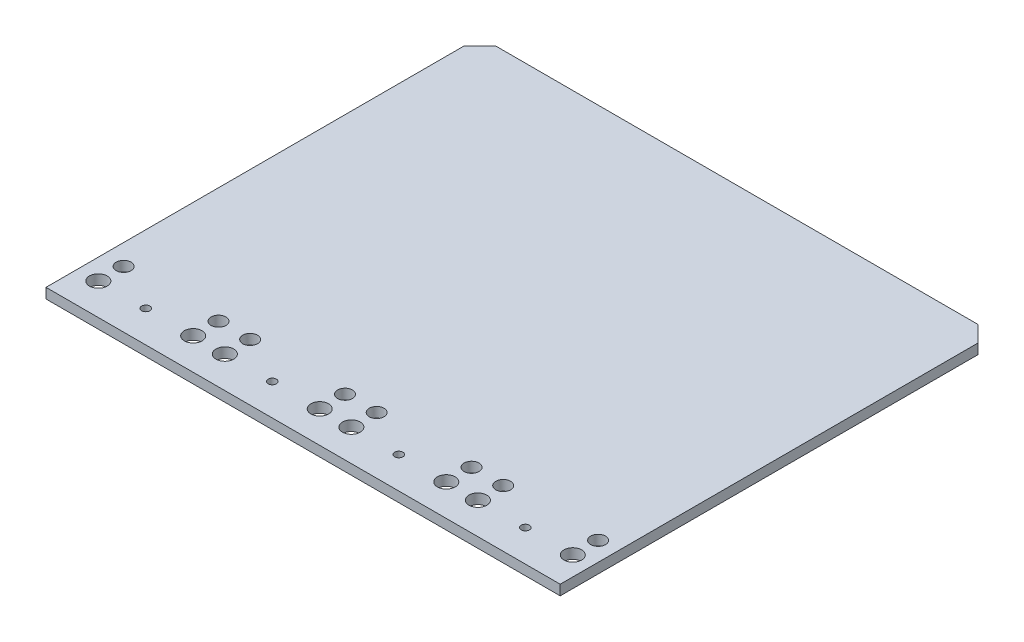
ISO-10303-21;
HEADER;
FILE_DESCRIPTION(('STEP AP214'),'2;1');
FILE_NAME('part.step','',(''),(''),'','','');
FILE_SCHEMA(('AUTOMOTIVE_DESIGN { 1 0 10303 214 1 1 1 1 }'));
ENDSEC;
DATA;
#1=APPLICATION_CONTEXT('core data for automotive mechanical design processes');
#2=APPLICATION_PROTOCOL_DEFINITION('international standard','automotive_design',2000,#1);
#3=PRODUCT_CONTEXT('',#1,'mechanical');
#4=PRODUCT('Part','Part','',(#3));
#5=PRODUCT_RELATED_PRODUCT_CATEGORY('part','',(#4));
#6=PRODUCT_DEFINITION_FORMATION('','',#4);
#7=PRODUCT_DEFINITION_CONTEXT('part definition',#1,'design');
#8=PRODUCT_DEFINITION('design','',#6,#7);
#9=PRODUCT_DEFINITION_SHAPE('','',#8);
#10=(LENGTH_UNIT() NAMED_UNIT(*) SI_UNIT(.MILLI.,.METRE.));
#11=(NAMED_UNIT(*) PLANE_ANGLE_UNIT() SI_UNIT($,.RADIAN.));
#12=(NAMED_UNIT(*) SI_UNIT($,.STERADIAN.) SOLID_ANGLE_UNIT());
#13=UNCERTAINTY_MEASURE_WITH_UNIT(LENGTH_MEASURE(1.E-05),#10,'distance_accuracy_value','');
#14=(GEOMETRIC_REPRESENTATION_CONTEXT(3) GLOBAL_UNCERTAINTY_ASSIGNED_CONTEXT((#13)) GLOBAL_UNIT_ASSIGNED_CONTEXT((#10,
#11,#12)) REPRESENTATION_CONTEXT('',''));
#15=CARTESIAN_POINT('',(0.,0.,0.));
#16=DIRECTION('',(0.,0.,1.));
#17=DIRECTION('',(1.,0.,0.));
#18=AXIS2_PLACEMENT_3D('',#15,#16,#17);
#19=CARTESIAN_POINT('',(40.64,1.6,-34.29));
#20=DIRECTION('',(-1.,0.,0.));
#21=DIRECTION('',(0.,0.,1.));
#22=AXIS2_PLACEMENT_3D('',#19,#20,#21);
#23=PLANE('',#22);
#24=DIRECTION('',(0.,0.,-1.));
#25=VECTOR('',#24,1.);
#26=CARTESIAN_POINT('',(40.64,0.,-34.29));
#27=LINE('',#26,#25);
#28=CARTESIAN_POINT('',(40.64,0.,34.29));
#29=VERTEX_POINT('',#28);
#30=CARTESIAN_POINT('',(40.64,0.,-31.75));
#31=VERTEX_POINT('',#30);
#32=EDGE_CURVE('E111',#29,#31,#27,.T.);
#33=ORIENTED_EDGE('',*,*,#32,.T.);
#34=DIRECTION('',(0.,1.,0.));
#35=VECTOR('',#34,1.);
#36=CARTESIAN_POINT('',(40.64,1.6,-31.75));
#37=LINE('',#36,#35);
#38=CARTESIAN_POINT('',(40.64,1.6,-31.75));
#39=VERTEX_POINT('',#38);
#40=EDGE_CURVE('E53',#31,#39,#37,.T.);
#41=ORIENTED_EDGE('',*,*,#40,.T.);
#42=DIRECTION('',(0.,0.,-1.));
#43=VECTOR('',#42,1.);
#44=CARTESIAN_POINT('',(40.64,1.6,-34.29));
#45=LINE('',#44,#43);
#46=CARTESIAN_POINT('',(40.64,1.6,34.29));
#47=VERTEX_POINT('',#46);
#48=EDGE_CURVE('E119',#47,#39,#45,.T.);
#49=ORIENTED_EDGE('',*,*,#48,.F.);
#50=DIRECTION('',(0.,-1.,0.));
#51=VECTOR('',#50,1.);
#52=CARTESIAN_POINT('',(40.64,1.6,34.29));
#53=LINE('',#52,#51);
#54=EDGE_CURVE('E103',#47,#29,#53,.T.);
#55=ORIENTED_EDGE('',*,*,#54,.T.);
#56=EDGE_LOOP('',(#33,#41,#49,#55));
#57=FACE_BOUND('',#56,.T.);
#58=ADVANCED_FACE('F30',(#57),#23,.F.);
#59=CARTESIAN_POINT('',(-40.64,1.6,-34.29));
#60=DIRECTION('',(0.,0.,1.));
#61=DIRECTION('',(1.,0.,0.));
#62=AXIS2_PLACEMENT_3D('',#59,#60,#61);
#63=PLANE('',#62);
#64=DIRECTION('',(-1.,0.,0.));
#65=VECTOR('',#64,1.);
#66=CARTESIAN_POINT('',(-40.64,1.6,-34.29));
#67=LINE('',#66,#65);
#68=CARTESIAN_POINT('',(38.1,1.6,-34.29));
#69=VERTEX_POINT('',#68);
#70=CARTESIAN_POINT('',(-38.1,1.6,-34.29));
#71=VERTEX_POINT('',#70);
#72=EDGE_CURVE('E93',#69,#71,#67,.T.);
#73=ORIENTED_EDGE('',*,*,#72,.F.);
#74=DIRECTION('',(0.,-1.,0.));
#75=VECTOR('',#74,1.);
#76=CARTESIAN_POINT('',(38.1,1.6,-34.29));
#77=LINE('',#76,#75);
#78=CARTESIAN_POINT('',(38.1,0.,-34.29));
#79=VERTEX_POINT('',#78);
#80=EDGE_CURVE('E122',#69,#79,#77,.T.);
#81=ORIENTED_EDGE('',*,*,#80,.T.);
#82=DIRECTION('',(-1.,0.,0.));
#83=VECTOR('',#82,1.);
#84=CARTESIAN_POINT('',(-40.64,0.,-34.29));
#85=LINE('',#84,#83);
#86=CARTESIAN_POINT('',(-38.1,0.,-34.29));
#87=VERTEX_POINT('',#86);
#88=EDGE_CURVE('E113',#79,#87,#85,.T.);
#89=ORIENTED_EDGE('',*,*,#88,.T.);
#90=DIRECTION('',(0.,1.,0.));
#91=VECTOR('',#90,1.);
#92=CARTESIAN_POINT('',(-38.1,1.6,-34.29));
#93=LINE('',#92,#91);
#94=EDGE_CURVE('E102',#87,#71,#93,.T.);
#95=ORIENTED_EDGE('',*,*,#94,.T.);
#96=EDGE_LOOP('',(#73,#81,#89,#95));
#97=FACE_BOUND('',#96,.T.);
#98=ADVANCED_FACE('F215',(#97),#63,.F.);
#99=CARTESIAN_POINT('',(-40.64,1.6,-34.29));
#100=DIRECTION('',(1.,0.,0.));
#101=DIRECTION('',(0.,0.,-1.));
#102=AXIS2_PLACEMENT_3D('',#99,#100,#101);
#103=PLANE('',#102);
#104=DIRECTION('',(0.,0.,1.));
#105=VECTOR('',#104,1.);
#106=CARTESIAN_POINT('',(-40.64,1.6,-34.29));
#107=LINE('',#106,#105);
#108=CARTESIAN_POINT('',(-40.64,1.6,-31.75));
#109=VERTEX_POINT('',#108);
#110=CARTESIAN_POINT('',(-40.64,1.6,34.29));
#111=VERTEX_POINT('',#110);
#112=EDGE_CURVE('E83',#109,#111,#107,.T.);
#113=ORIENTED_EDGE('',*,*,#112,.F.);
#114=DIRECTION('',(0.,-1.,0.));
#115=VECTOR('',#114,1.);
#116=CARTESIAN_POINT('',(-40.64,1.6,-31.75));
#117=LINE('',#116,#115);
#118=CARTESIAN_POINT('',(-40.64,0.,-31.75));
#119=VERTEX_POINT('',#118);
#120=EDGE_CURVE('E133',#109,#119,#117,.T.);
#121=ORIENTED_EDGE('',*,*,#120,.T.);
#122=DIRECTION('',(0.,0.,1.));
#123=VECTOR('',#122,1.);
#124=CARTESIAN_POINT('',(-40.64,0.,-34.29));
#125=LINE('',#124,#123);
#126=CARTESIAN_POINT('',(-40.64,0.,34.29));
#127=VERTEX_POINT('',#126);
#128=EDGE_CURVE('E99',#119,#127,#125,.T.);
#129=ORIENTED_EDGE('',*,*,#128,.T.);
#130=DIRECTION('',(0.,-1.,0.));
#131=VECTOR('',#130,1.);
#132=CARTESIAN_POINT('',(-40.64,1.6,34.29));
#133=LINE('',#132,#131);
#134=EDGE_CURVE('E96',#111,#127,#133,.T.);
#135=ORIENTED_EDGE('',*,*,#134,.F.);
#136=EDGE_LOOP('',(#113,#121,#129,#135));
#137=FACE_BOUND('',#136,.T.);
#138=ADVANCED_FACE('F97',(#137),#103,.F.);
#139=CARTESIAN_POINT('',(-40.64,1.6,34.29));
#140=DIRECTION('',(0.,0.,-1.));
#141=DIRECTION('',(-1.,0.,0.));
#142=AXIS2_PLACEMENT_3D('',#139,#140,#141);
#143=PLANE('',#142);
#144=DIRECTION('',(1.,0.,0.));
#145=VECTOR('',#144,1.);
#146=CARTESIAN_POINT('',(-40.64,0.,34.29));
#147=LINE('',#146,#145);
#148=EDGE_CURVE('E118',#127,#29,#147,.T.);
#149=ORIENTED_EDGE('',*,*,#148,.T.);
#150=ORIENTED_EDGE('',*,*,#54,.F.);
#151=DIRECTION('',(1.,0.,0.));
#152=VECTOR('',#151,1.);
#153=CARTESIAN_POINT('',(-40.64,1.6,34.29));
#154=LINE('',#153,#152);
#155=EDGE_CURVE('E88',#111,#47,#154,.T.);
#156=ORIENTED_EDGE('',*,*,#155,.F.);
#157=ORIENTED_EDGE('',*,*,#134,.T.);
#158=EDGE_LOOP('',(#149,#150,#156,#157));
#159=FACE_BOUND('',#158,.T.);
#160=ADVANCED_FACE('F105',(#159),#143,.F.);
#161=CARTESIAN_POINT('',(40.64,1.6,34.29));
#162=DIRECTION('',(0.,1.,0.));
#163=DIRECTION('',(0.,0.,1.));
#164=AXIS2_PLACEMENT_3D('',#161,#162,#163);
#165=PLANE('',#164);
#166=CARTESIAN_POINT('',(-17.37,1.6,25.29));
#167=DIRECTION('',(0.,1.,0.));
#168=DIRECTION('',(0.,0.,1.));
#169=AXIS2_PLACEMENT_3D('',#166,#167,#168);
#170=CIRCLE('',#169,1.175);
#171=CARTESIAN_POINT('',(-17.37,1.6,26.465));
#172=VERTEX_POINT('',#171);
#173=EDGE_CURVE('E406',#172,#172,#170,.F.);
#174=ORIENTED_EDGE('',*,*,#173,.T.);
#175=EDGE_LOOP('',(#174));
#176=FACE_BOUND('',#175,.T.);
#177=CARTESIAN_POINT('',(-2.36999999999999,1.6,29.29));
#178=DIRECTION('',(0.,1.,0.));
#179=DIRECTION('',(0.,0.,1.));
#180=AXIS2_PLACEMENT_3D('',#177,#178,#179);
#181=CIRCLE('',#180,1.4);
#182=CARTESIAN_POINT('',(-2.36999999999999,1.6,30.69));
#183=VERTEX_POINT('',#182);
#184=EDGE_CURVE('E400',#183,#183,#181,.F.);
#185=ORIENTED_EDGE('',*,*,#184,.T.);
#186=EDGE_LOOP('',(#185));
#187=FACE_BOUND('',#186,.T.);
#188=CARTESIAN_POINT('',(-17.37,1.6,29.29));
#189=DIRECTION('',(0.,1.,0.));
#190=DIRECTION('',(0.,0.,1.));
#191=AXIS2_PLACEMENT_3D('',#188,#189,#190);
#192=CIRCLE('',#191,1.4);
#193=CARTESIAN_POINT('',(-17.37,1.6,30.69));
#194=VERTEX_POINT('',#193);
#195=EDGE_CURVE('E394',#194,#194,#192,.F.);
#196=ORIENTED_EDGE('',*,*,#195,.T.);
#197=EDGE_LOOP('',(#196));
#198=FACE_BOUND('',#197,.T.);
#199=CARTESIAN_POINT('',(-9.86999999999999,1.6,29.29));
#200=DIRECTION('',(0.,1.,0.));
#201=DIRECTION('',(0.,0.,1.));
#202=AXIS2_PLACEMENT_3D('',#199,#200,#201);
#203=CIRCLE('',#202,0.650000000000001);
#204=CARTESIAN_POINT('',(-9.86999999999999,1.6,29.94));
#205=VERTEX_POINT('',#204);
#206=EDGE_CURVE('E388',#205,#205,#203,.F.);
#207=ORIENTED_EDGE('',*,*,#206,.T.);
#208=EDGE_LOOP('',(#207));
#209=FACE_BOUND('',#208,.T.);
#210=CARTESIAN_POINT('',(-2.36999999999999,1.6,25.29));
#211=DIRECTION('',(0.,1.,0.));
#212=DIRECTION('',(0.,0.,1.));
#213=AXIS2_PLACEMENT_3D('',#210,#211,#212);
#214=CIRCLE('',#213,1.17499999999999);
#215=CARTESIAN_POINT('',(-2.36999999999999,1.6,26.465));
#216=VERTEX_POINT('',#215);
#217=EDGE_CURVE('E382',#216,#216,#214,.F.);
#218=ORIENTED_EDGE('',*,*,#217,.T.);
#219=EDGE_LOOP('',(#218));
#220=FACE_BOUND('',#219,.T.);
#221=CARTESIAN_POINT('',(-22.37,1.6,25.29));
#222=DIRECTION('',(0.,1.,0.));
#223=DIRECTION('',(0.,0.,1.));
#224=AXIS2_PLACEMENT_3D('',#221,#222,#223);
#225=CIRCLE('',#224,1.17499999999999);
#226=CARTESIAN_POINT('',(-22.37,1.6,26.465));
#227=VERTEX_POINT('',#226);
#228=EDGE_CURVE('E374',#227,#227,#225,.F.);
#229=ORIENTED_EDGE('',*,*,#228,.T.);
#230=EDGE_LOOP('',(#229));
#231=FACE_BOUND('',#230,.T.);
#232=CARTESIAN_POINT('',(-37.37,1.6,25.29));
#233=DIRECTION('',(0.,1.,0.));
#234=DIRECTION('',(0.,0.,1.));
#235=AXIS2_PLACEMENT_3D('',#232,#233,#234);
#236=CIRCLE('',#235,1.175);
#237=CARTESIAN_POINT('',(-37.37,1.6,26.465));
#238=VERTEX_POINT('',#237);
#239=EDGE_CURVE('E368',#238,#238,#236,.F.);
#240=ORIENTED_EDGE('',*,*,#239,.T.);
#241=EDGE_LOOP('',(#240));
#242=FACE_BOUND('',#241,.T.);
#243=CARTESIAN_POINT('',(-22.37,1.6,29.29));
#244=DIRECTION('',(0.,1.,0.));
#245=DIRECTION('',(0.,0.,1.));
#246=AXIS2_PLACEMENT_3D('',#243,#244,#245);
#247=CIRCLE('',#246,1.4);
#248=CARTESIAN_POINT('',(-22.37,1.6,30.69));
#249=VERTEX_POINT('',#248);
#250=EDGE_CURVE('E362',#249,#249,#247,.F.);
#251=ORIENTED_EDGE('',*,*,#250,.T.);
#252=EDGE_LOOP('',(#251));
#253=FACE_BOUND('',#252,.T.);
#254=CARTESIAN_POINT('',(-37.37,1.6,29.29));
#255=DIRECTION('',(0.,1.,0.));
#256=DIRECTION('',(0.,0.,1.));
#257=AXIS2_PLACEMENT_3D('',#254,#255,#256);
#258=CIRCLE('',#257,1.4);
#259=CARTESIAN_POINT('',(-37.37,1.6,30.69));
#260=VERTEX_POINT('',#259);
#261=EDGE_CURVE('E324',#260,#260,#258,.F.);
#262=ORIENTED_EDGE('',*,*,#261,.T.);
#263=EDGE_LOOP('',(#262));
#264=FACE_BOUND('',#263,.T.);
#265=CARTESIAN_POINT('',(-29.87,1.6,29.29));
#266=DIRECTION('',(0.,1.,0.));
#267=DIRECTION('',(0.,0.,1.));
#268=AXIS2_PLACEMENT_3D('',#265,#266,#267);
#269=CIRCLE('',#268,0.650000000000001);
#270=CARTESIAN_POINT('',(-29.87,1.6,29.94));
#271=VERTEX_POINT('',#270);
#272=EDGE_CURVE('E316',#271,#271,#269,.F.);
#273=ORIENTED_EDGE('',*,*,#272,.T.);
#274=EDGE_LOOP('',(#273));
#275=FACE_BOUND('',#274,.T.);
#276=ORIENTED_EDGE('',*,*,#48,.T.);
#277=DIRECTION('',(0.707106781186546,0.,0.707106781186549));
#278=VECTOR('',#277,1.);
#279=CARTESIAN_POINT('',(73.66,1.6,1.27000000000019));
#280=LINE('',#279,#278);
#281=EDGE_CURVE('E131',#39,#69,#280,.F.);
#282=ORIENTED_EDGE('',*,*,#281,.T.);
#283=ORIENTED_EDGE('',*,*,#72,.T.);
#284=DIRECTION('',(0.707106781186548,0.,-0.707106781186548));
#285=VECTOR('',#284,1.);
#286=CARTESIAN_POINT('',(-33.02,1.6,-39.37));
#287=LINE('',#286,#285);
#288=EDGE_CURVE('E45',#71,#109,#287,.F.);
#289=ORIENTED_EDGE('',*,*,#288,.T.);
#290=ORIENTED_EDGE('',*,*,#112,.T.);
#291=ORIENTED_EDGE('',*,*,#155,.T.);
#292=EDGE_LOOP('',(#276,#282,#283,#289,#290,#291));
#293=FACE_BOUND('',#292,.T.);
#294=CARTESIAN_POINT('',(17.63,1.6,25.29));
#295=DIRECTION('',(0.,1.,0.));
#296=DIRECTION('',(0.,0.,1.));
#297=AXIS2_PLACEMENT_3D('',#294,#295,#296);
#298=CIRCLE('',#297,1.17499999999999);
#299=CARTESIAN_POINT('',(17.63,1.6,26.465));
#300=VERTEX_POINT('',#299);
#301=EDGE_CURVE('E135',#300,#300,#298,.F.);
#302=ORIENTED_EDGE('',*,*,#301,.T.);
#303=EDGE_LOOP('',(#302));
#304=FACE_BOUND('',#303,.T.);
#305=CARTESIAN_POINT('',(37.63,1.6,25.29));
#306=DIRECTION('',(0.,1.,0.));
#307=DIRECTION('',(0.,0.,1.));
#308=AXIS2_PLACEMENT_3D('',#305,#306,#307);
#309=CIRCLE('',#308,1.17499999999999);
#310=CARTESIAN_POINT('',(37.63,1.6,26.465));
#311=VERTEX_POINT('',#310);
#312=EDGE_CURVE('E141',#311,#311,#309,.F.);
#313=ORIENTED_EDGE('',*,*,#312,.T.);
#314=EDGE_LOOP('',(#313));
#315=FACE_BOUND('',#314,.T.);
#316=CARTESIAN_POINT('',(10.13,1.6,29.29));
#317=DIRECTION('',(0.,1.,0.));
#318=DIRECTION('',(0.,0.,1.));
#319=AXIS2_PLACEMENT_3D('',#316,#317,#318);
#320=CIRCLE('',#319,0.650000000000001);
#321=CARTESIAN_POINT('',(10.13,1.6,29.94));
#322=VERTEX_POINT('',#321);
#323=EDGE_CURVE('E147',#322,#322,#320,.F.);
#324=ORIENTED_EDGE('',*,*,#323,.T.);
#325=EDGE_LOOP('',(#324));
#326=FACE_BOUND('',#325,.T.);
#327=CARTESIAN_POINT('',(30.13,1.6,29.29));
#328=DIRECTION('',(0.,1.,0.));
#329=DIRECTION('',(0.,0.,1.));
#330=AXIS2_PLACEMENT_3D('',#327,#328,#329);
#331=CIRCLE('',#330,0.650000000000001);
#332=CARTESIAN_POINT('',(30.13,1.6,29.94));
#333=VERTEX_POINT('',#332);
#334=EDGE_CURVE('E153',#333,#333,#331,.F.);
#335=ORIENTED_EDGE('',*,*,#334,.T.);
#336=EDGE_LOOP('',(#335));
#337=FACE_BOUND('',#336,.T.);
#338=CARTESIAN_POINT('',(2.63000000000001,1.6,29.29));
#339=DIRECTION('',(0.,1.,0.));
#340=DIRECTION('',(0.,0.,1.));
#341=AXIS2_PLACEMENT_3D('',#338,#339,#340);
#342=CIRCLE('',#341,1.4);
#343=CARTESIAN_POINT('',(2.63000000000001,1.6,30.69));
#344=VERTEX_POINT('',#343);
#345=EDGE_CURVE('E159',#344,#344,#342,.F.);
#346=ORIENTED_EDGE('',*,*,#345,.T.);
#347=EDGE_LOOP('',(#346));
#348=FACE_BOUND('',#347,.T.);
#349=CARTESIAN_POINT('',(22.63,1.6,29.29));
#350=DIRECTION('',(0.,1.,0.));
#351=DIRECTION('',(0.,0.,1.));
#352=AXIS2_PLACEMENT_3D('',#349,#350,#351);
#353=CIRCLE('',#352,1.4);
#354=CARTESIAN_POINT('',(22.63,1.6,30.69));
#355=VERTEX_POINT('',#354);
#356=EDGE_CURVE('E165',#355,#355,#353,.F.);
#357=ORIENTED_EDGE('',*,*,#356,.T.);
#358=EDGE_LOOP('',(#357));
#359=FACE_BOUND('',#358,.T.);
#360=CARTESIAN_POINT('',(17.63,1.6,29.29));
#361=DIRECTION('',(0.,1.,0.));
#362=DIRECTION('',(0.,0.,1.));
#363=AXIS2_PLACEMENT_3D('',#360,#361,#362);
#364=CIRCLE('',#363,1.4);
#365=CARTESIAN_POINT('',(17.63,1.6,30.69));
#366=VERTEX_POINT('',#365);
#367=EDGE_CURVE('E171',#366,#366,#364,.F.);
#368=ORIENTED_EDGE('',*,*,#367,.T.);
#369=EDGE_LOOP('',(#368));
#370=FACE_BOUND('',#369,.T.);
#371=CARTESIAN_POINT('',(37.63,1.6,29.29));
#372=DIRECTION('',(0.,1.,0.));
#373=DIRECTION('',(0.,0.,1.));
#374=AXIS2_PLACEMENT_3D('',#371,#372,#373);
#375=CIRCLE('',#374,1.4);
#376=CARTESIAN_POINT('',(37.63,1.6,30.69));
#377=VERTEX_POINT('',#376);
#378=EDGE_CURVE('E177',#377,#377,#375,.F.);
#379=ORIENTED_EDGE('',*,*,#378,.T.);
#380=EDGE_LOOP('',(#379));
#381=FACE_BOUND('',#380,.T.);
#382=CARTESIAN_POINT('',(2.63000000000001,1.6,25.29));
#383=DIRECTION('',(0.,1.,0.));
#384=DIRECTION('',(0.,0.,1.));
#385=AXIS2_PLACEMENT_3D('',#382,#383,#384);
#386=CIRCLE('',#385,1.175);
#387=CARTESIAN_POINT('',(2.63000000000001,1.6,26.465));
#388=VERTEX_POINT('',#387);
#389=EDGE_CURVE('E183',#388,#388,#386,.F.);
#390=ORIENTED_EDGE('',*,*,#389,.T.);
#391=EDGE_LOOP('',(#390));
#392=FACE_BOUND('',#391,.T.);
#393=CARTESIAN_POINT('',(22.63,1.6,25.29));
#394=DIRECTION('',(0.,1.,0.));
#395=DIRECTION('',(0.,0.,1.));
#396=AXIS2_PLACEMENT_3D('',#393,#394,#395);
#397=CIRCLE('',#396,1.175);
#398=CARTESIAN_POINT('',(22.63,1.6,26.465));
#399=VERTEX_POINT('',#398);
#400=EDGE_CURVE('E38',#399,#399,#397,.F.);
#401=ORIENTED_EDGE('',*,*,#400,.T.);
#402=EDGE_LOOP('',(#401));
#403=FACE_BOUND('',#402,.T.);
#404=ADVANCED_FACE('F85',(#176,#187,#198,#209,#220,#231,#242,#253,#264,#275,#293,#304,#315,#326,
#337,#348,#359,#370,#381,#392,#403),#165,.T.);
#405=CARTESIAN_POINT('',(40.64,0.,34.29));
#406=DIRECTION('',(0.,1.,0.));
#407=DIRECTION('',(0.,0.,1.));
#408=AXIS2_PLACEMENT_3D('',#405,#406,#407);
#409=PLANE('',#408);
#410=CARTESIAN_POINT('',(-17.37,0.,25.29));
#411=DIRECTION('',(0.,-1.,0.));
#412=DIRECTION('',(0.,0.,-1.));
#413=AXIS2_PLACEMENT_3D('',#410,#411,#412);
#414=CIRCLE('',#413,1.175);
#415=CARTESIAN_POINT('',(-17.37,0.,24.115));
#416=VERTEX_POINT('',#415);
#417=EDGE_CURVE('E403',#416,#416,#414,.T.);
#418=ORIENTED_EDGE('',*,*,#417,.F.);
#419=EDGE_LOOP('',(#418));
#420=FACE_BOUND('',#419,.T.);
#421=CARTESIAN_POINT('',(-2.36999999999999,0.,29.29));
#422=DIRECTION('',(0.,-1.,0.));
#423=DIRECTION('',(0.,0.,-1.));
#424=AXIS2_PLACEMENT_3D('',#421,#422,#423);
#425=CIRCLE('',#424,1.4);
#426=CARTESIAN_POINT('',(-2.36999999999999,0.,27.89));
#427=VERTEX_POINT('',#426);
#428=EDGE_CURVE('E397',#427,#427,#425,.T.);
#429=ORIENTED_EDGE('',*,*,#428,.F.);
#430=EDGE_LOOP('',(#429));
#431=FACE_BOUND('',#430,.T.);
#432=CARTESIAN_POINT('',(-17.37,0.,29.29));
#433=DIRECTION('',(0.,-1.,0.));
#434=DIRECTION('',(0.,0.,-1.));
#435=AXIS2_PLACEMENT_3D('',#432,#433,#434);
#436=CIRCLE('',#435,1.4);
#437=CARTESIAN_POINT('',(-17.37,0.,27.89));
#438=VERTEX_POINT('',#437);
#439=EDGE_CURVE('E391',#438,#438,#436,.T.);
#440=ORIENTED_EDGE('',*,*,#439,.F.);
#441=EDGE_LOOP('',(#440));
#442=FACE_BOUND('',#441,.T.);
#443=CARTESIAN_POINT('',(-9.86999999999999,0.,29.29));
#444=DIRECTION('',(0.,-1.,0.));
#445=DIRECTION('',(0.,0.,-1.));
#446=AXIS2_PLACEMENT_3D('',#443,#444,#445);
#447=CIRCLE('',#446,0.650000000000001);
#448=CARTESIAN_POINT('',(-9.86999999999999,0.,28.64));
#449=VERTEX_POINT('',#448);
#450=EDGE_CURVE('E385',#449,#449,#447,.T.);
#451=ORIENTED_EDGE('',*,*,#450,.F.);
#452=EDGE_LOOP('',(#451));
#453=FACE_BOUND('',#452,.T.);
#454=CARTESIAN_POINT('',(-2.36999999999999,0.,25.29));
#455=DIRECTION('',(0.,-1.,0.));
#456=DIRECTION('',(0.,0.,-1.));
#457=AXIS2_PLACEMENT_3D('',#454,#455,#456);
#458=CIRCLE('',#457,1.17499999999999);
#459=CARTESIAN_POINT('',(-2.36999999999999,0.,24.115));
#460=VERTEX_POINT('',#459);
#461=EDGE_CURVE('E377',#460,#460,#458,.T.);
#462=ORIENTED_EDGE('',*,*,#461,.F.);
#463=EDGE_LOOP('',(#462));
#464=FACE_BOUND('',#463,.T.);
#465=CARTESIAN_POINT('',(-22.37,0.,25.29));
#466=DIRECTION('',(0.,-1.,0.));
#467=DIRECTION('',(0.,0.,-1.));
#468=AXIS2_PLACEMENT_3D('',#465,#466,#467);
#469=CIRCLE('',#468,1.17499999999999);
#470=CARTESIAN_POINT('',(-22.37,0.,24.115));
#471=VERTEX_POINT('',#470);
#472=EDGE_CURVE('E371',#471,#471,#469,.T.);
#473=ORIENTED_EDGE('',*,*,#472,.F.);
#474=EDGE_LOOP('',(#473));
#475=FACE_BOUND('',#474,.T.);
#476=CARTESIAN_POINT('',(-37.37,0.,25.29));
#477=DIRECTION('',(0.,-1.,0.));
#478=DIRECTION('',(0.,0.,-1.));
#479=AXIS2_PLACEMENT_3D('',#476,#477,#478);
#480=CIRCLE('',#479,1.175);
#481=CARTESIAN_POINT('',(-37.37,0.,24.115));
#482=VERTEX_POINT('',#481);
#483=EDGE_CURVE('E365',#482,#482,#480,.T.);
#484=ORIENTED_EDGE('',*,*,#483,.F.);
#485=EDGE_LOOP('',(#484));
#486=FACE_BOUND('',#485,.T.);
#487=CARTESIAN_POINT('',(-22.37,0.,29.29));
#488=DIRECTION('',(0.,-1.,0.));
#489=DIRECTION('',(0.,0.,-1.));
#490=AXIS2_PLACEMENT_3D('',#487,#488,#489);
#491=CIRCLE('',#490,1.4);
#492=CARTESIAN_POINT('',(-22.37,0.,27.89));
#493=VERTEX_POINT('',#492);
#494=EDGE_CURVE('E359',#493,#493,#491,.T.);
#495=ORIENTED_EDGE('',*,*,#494,.F.);
#496=EDGE_LOOP('',(#495));
#497=FACE_BOUND('',#496,.T.);
#498=CARTESIAN_POINT('',(-37.37,0.,29.29));
#499=DIRECTION('',(0.,-1.,0.));
#500=DIRECTION('',(0.,0.,-1.));
#501=AXIS2_PLACEMENT_3D('',#498,#499,#500);
#502=CIRCLE('',#501,1.4);
#503=CARTESIAN_POINT('',(-37.37,0.,27.89));
#504=VERTEX_POINT('',#503);
#505=EDGE_CURVE('E321',#504,#504,#502,.T.);
#506=ORIENTED_EDGE('',*,*,#505,.F.);
#507=EDGE_LOOP('',(#506));
#508=FACE_BOUND('',#507,.T.);
#509=CARTESIAN_POINT('',(-29.87,0.,29.29));
#510=DIRECTION('',(0.,-1.,0.));
#511=DIRECTION('',(0.,0.,-1.));
#512=AXIS2_PLACEMENT_3D('',#509,#510,#511);
#513=CIRCLE('',#512,0.650000000000001);
#514=CARTESIAN_POINT('',(-29.87,0.,28.64));
#515=VERTEX_POINT('',#514);
#516=EDGE_CURVE('E114',#515,#515,#513,.T.);
#517=ORIENTED_EDGE('',*,*,#516,.F.);
#518=EDGE_LOOP('',(#517));
#519=FACE_BOUND('',#518,.T.);
#520=ORIENTED_EDGE('',*,*,#88,.F.);
#521=DIRECTION('',(-0.707106781186546,0.,-0.707106781186549));
#522=VECTOR('',#521,1.);
#523=CARTESIAN_POINT('',(38.1,0.,-34.29));
#524=LINE('',#523,#522);
#525=EDGE_CURVE('E127',#79,#31,#524,.F.);
#526=ORIENTED_EDGE('',*,*,#525,.T.);
#527=ORIENTED_EDGE('',*,*,#32,.F.);
#528=ORIENTED_EDGE('',*,*,#148,.F.);
#529=ORIENTED_EDGE('',*,*,#128,.F.);
#530=DIRECTION('',(-0.707106781186548,0.,0.707106781186548));
#531=VECTOR('',#530,1.);
#532=CARTESIAN_POINT('',(-40.64,0.,-31.75));
#533=LINE('',#532,#531);
#534=EDGE_CURVE('E125',#119,#87,#533,.F.);
#535=ORIENTED_EDGE('',*,*,#534,.T.);
#536=EDGE_LOOP('',(#520,#526,#527,#528,#529,#535));
#537=FACE_BOUND('',#536,.T.);
#538=CARTESIAN_POINT('',(17.63,0.,25.29));
#539=DIRECTION('',(0.,-1.,0.));
#540=DIRECTION('',(0.,0.,-1.));
#541=AXIS2_PLACEMENT_3D('',#538,#539,#540);
#542=CIRCLE('',#541,1.17499999999999);
#543=CARTESIAN_POINT('',(17.63,0.,24.115));
#544=VERTEX_POINT('',#543);
#545=EDGE_CURVE('E138',#544,#544,#542,.T.);
#546=ORIENTED_EDGE('',*,*,#545,.F.);
#547=EDGE_LOOP('',(#546));
#548=FACE_BOUND('',#547,.T.);
#549=CARTESIAN_POINT('',(37.63,0.,25.29));
#550=DIRECTION('',(0.,-1.,0.));
#551=DIRECTION('',(0.,0.,-1.));
#552=AXIS2_PLACEMENT_3D('',#549,#550,#551);
#553=CIRCLE('',#552,1.17499999999999);
#554=CARTESIAN_POINT('',(37.63,0.,24.115));
#555=VERTEX_POINT('',#554);
#556=EDGE_CURVE('E144',#555,#555,#553,.T.);
#557=ORIENTED_EDGE('',*,*,#556,.F.);
#558=EDGE_LOOP('',(#557));
#559=FACE_BOUND('',#558,.T.);
#560=CARTESIAN_POINT('',(10.13,0.,29.29));
#561=DIRECTION('',(0.,-1.,0.));
#562=DIRECTION('',(0.,0.,-1.));
#563=AXIS2_PLACEMENT_3D('',#560,#561,#562);
#564=CIRCLE('',#563,0.650000000000001);
#565=CARTESIAN_POINT('',(10.13,0.,28.64));
#566=VERTEX_POINT('',#565);
#567=EDGE_CURVE('E150',#566,#566,#564,.T.);
#568=ORIENTED_EDGE('',*,*,#567,.F.);
#569=EDGE_LOOP('',(#568));
#570=FACE_BOUND('',#569,.T.);
#571=CARTESIAN_POINT('',(30.13,0.,29.29));
#572=DIRECTION('',(0.,-1.,0.));
#573=DIRECTION('',(0.,0.,-1.));
#574=AXIS2_PLACEMENT_3D('',#571,#572,#573);
#575=CIRCLE('',#574,0.650000000000001);
#576=CARTESIAN_POINT('',(30.13,0.,28.64));
#577=VERTEX_POINT('',#576);
#578=EDGE_CURVE('E156',#577,#577,#575,.T.);
#579=ORIENTED_EDGE('',*,*,#578,.F.);
#580=EDGE_LOOP('',(#579));
#581=FACE_BOUND('',#580,.T.);
#582=CARTESIAN_POINT('',(2.63000000000001,0.,29.29));
#583=DIRECTION('',(0.,-1.,0.));
#584=DIRECTION('',(0.,0.,-1.));
#585=AXIS2_PLACEMENT_3D('',#582,#583,#584);
#586=CIRCLE('',#585,1.4);
#587=CARTESIAN_POINT('',(2.63000000000001,0.,27.89));
#588=VERTEX_POINT('',#587);
#589=EDGE_CURVE('E162',#588,#588,#586,.T.);
#590=ORIENTED_EDGE('',*,*,#589,.F.);
#591=EDGE_LOOP('',(#590));
#592=FACE_BOUND('',#591,.T.);
#593=CARTESIAN_POINT('',(22.63,0.,29.29));
#594=DIRECTION('',(0.,-1.,0.));
#595=DIRECTION('',(0.,0.,-1.));
#596=AXIS2_PLACEMENT_3D('',#593,#594,#595);
#597=CIRCLE('',#596,1.4);
#598=CARTESIAN_POINT('',(22.63,0.,27.89));
#599=VERTEX_POINT('',#598);
#600=EDGE_CURVE('E168',#599,#599,#597,.T.);
#601=ORIENTED_EDGE('',*,*,#600,.F.);
#602=EDGE_LOOP('',(#601));
#603=FACE_BOUND('',#602,.T.);
#604=CARTESIAN_POINT('',(17.63,0.,29.29));
#605=DIRECTION('',(0.,-1.,0.));
#606=DIRECTION('',(0.,0.,-1.));
#607=AXIS2_PLACEMENT_3D('',#604,#605,#606);
#608=CIRCLE('',#607,1.4);
#609=CARTESIAN_POINT('',(17.63,0.,27.89));
#610=VERTEX_POINT('',#609);
#611=EDGE_CURVE('E174',#610,#610,#608,.T.);
#612=ORIENTED_EDGE('',*,*,#611,.F.);
#613=EDGE_LOOP('',(#612));
#614=FACE_BOUND('',#613,.T.);
#615=CARTESIAN_POINT('',(37.63,0.,29.29));
#616=DIRECTION('',(0.,-1.,0.));
#617=DIRECTION('',(0.,0.,-1.));
#618=AXIS2_PLACEMENT_3D('',#615,#616,#617);
#619=CIRCLE('',#618,1.4);
#620=CARTESIAN_POINT('',(37.63,0.,27.89));
#621=VERTEX_POINT('',#620);
#622=EDGE_CURVE('E180',#621,#621,#619,.T.);
#623=ORIENTED_EDGE('',*,*,#622,.F.);
#624=EDGE_LOOP('',(#623));
#625=FACE_BOUND('',#624,.T.);
#626=CARTESIAN_POINT('',(2.63000000000001,0.,25.29));
#627=DIRECTION('',(0.,-1.,0.));
#628=DIRECTION('',(0.,0.,-1.));
#629=AXIS2_PLACEMENT_3D('',#626,#627,#628);
#630=CIRCLE('',#629,1.175);
#631=CARTESIAN_POINT('',(2.63000000000001,0.,24.115));
#632=VERTEX_POINT('',#631);
#633=EDGE_CURVE('E186',#632,#632,#630,.T.);
#634=ORIENTED_EDGE('',*,*,#633,.F.);
#635=EDGE_LOOP('',(#634));
#636=FACE_BOUND('',#635,.T.);
#637=CARTESIAN_POINT('',(22.63,0.,25.29));
#638=DIRECTION('',(0.,-1.,0.));
#639=DIRECTION('',(0.,0.,-1.));
#640=AXIS2_PLACEMENT_3D('',#637,#638,#639);
#641=CIRCLE('',#640,1.175);
#642=CARTESIAN_POINT('',(22.63,0.,24.115));
#643=VERTEX_POINT('',#642);
#644=EDGE_CURVE('E11',#643,#643,#641,.T.);
#645=ORIENTED_EDGE('',*,*,#644,.F.);
#646=EDGE_LOOP('',(#645));
#647=FACE_BOUND('',#646,.T.);
#648=ADVANCED_FACE('F197',(#420,#431,#442,#453,#464,#475,#486,#497,#508,#519,#537,#548,#559,
#570,#581,#592,#603,#614,#625,#636,#647),#409,.F.);
#649=CARTESIAN_POINT('',(38.1,1.6,-34.29));
#650=DIRECTION('',(-0.707106781186549,0.,0.707106781186545));
#651=DIRECTION('',(0.707106781186546,0.,0.707106781186549));
#652=AXIS2_PLACEMENT_3D('',#649,#650,#651);
#653=PLANE('',#652);
#654=ORIENTED_EDGE('',*,*,#281,.F.);
#655=ORIENTED_EDGE('',*,*,#40,.F.);
#656=ORIENTED_EDGE('',*,*,#525,.F.);
#657=ORIENTED_EDGE('',*,*,#80,.F.);
#658=EDGE_LOOP('',(#654,#655,#656,#657));
#659=FACE_BOUND('',#658,.T.);
#660=ADVANCED_FACE('F199',(#659),#653,.F.);
#661=CARTESIAN_POINT('',(-40.64,1.6,-31.75));
#662=DIRECTION('',(0.707106781186548,0.,0.707106781186548));
#663=DIRECTION('',(0.707106781186548,0.,-0.707106781186548));
#664=AXIS2_PLACEMENT_3D('',#661,#662,#663);
#665=PLANE('',#664);
#666=ORIENTED_EDGE('',*,*,#288,.F.);
#667=ORIENTED_EDGE('',*,*,#94,.F.);
#668=ORIENTED_EDGE('',*,*,#534,.F.);
#669=ORIENTED_EDGE('',*,*,#120,.F.);
#670=EDGE_LOOP('',(#666,#667,#668,#669));
#671=FACE_BOUND('',#670,.T.);
#672=ADVANCED_FACE('F206',(#671),#665,.F.);
#673=CARTESIAN_POINT('',(-29.87,1.601,29.29));
#674=DIRECTION('',(0.,-1.,0.));
#675=DIRECTION('',(0.,0.,-1.));
#676=AXIS2_PLACEMENT_3D('',#673,#674,#675);
#677=CYLINDRICAL_SURFACE('',#676,0.650000000000001);
#678=ORIENTED_EDGE('',*,*,#272,.F.);
#679=EDGE_LOOP('',(#678));
#680=FACE_BOUND('',#679,.T.);
#681=ORIENTED_EDGE('',*,*,#516,.T.);
#682=EDGE_LOOP('',(#681));
#683=FACE_BOUND('',#682,.T.);
#684=ADVANCED_FACE('F226',(#680,#683),#677,.F.);
#685=CARTESIAN_POINT('',(-37.37,1.601,29.29));
#686=DIRECTION('',(0.,-1.,0.));
#687=DIRECTION('',(0.,0.,-1.));
#688=AXIS2_PLACEMENT_3D('',#685,#686,#687);
#689=CYLINDRICAL_SURFACE('',#688,1.4);
#690=ORIENTED_EDGE('',*,*,#261,.F.);
#691=EDGE_LOOP('',(#690));
#692=FACE_BOUND('',#691,.T.);
#693=ORIENTED_EDGE('',*,*,#505,.T.);
#694=EDGE_LOOP('',(#693));
#695=FACE_BOUND('',#694,.T.);
#696=ADVANCED_FACE('F304',(#692,#695),#689,.F.);
#697=CARTESIAN_POINT('',(-22.37,1.601,29.29));
#698=DIRECTION('',(0.,-1.,0.));
#699=DIRECTION('',(0.,0.,-1.));
#700=AXIS2_PLACEMENT_3D('',#697,#698,#699);
#701=CYLINDRICAL_SURFACE('',#700,1.4);
#702=ORIENTED_EDGE('',*,*,#250,.F.);
#703=EDGE_LOOP('',(#702));
#704=FACE_BOUND('',#703,.T.);
#705=ORIENTED_EDGE('',*,*,#494,.T.);
#706=EDGE_LOOP('',(#705));
#707=FACE_BOUND('',#706,.T.);
#708=ADVANCED_FACE('F300',(#704,#707),#701,.F.);
#709=CARTESIAN_POINT('',(-37.37,1.601,25.29));
#710=DIRECTION('',(0.,-1.,0.));
#711=DIRECTION('',(0.,0.,-1.));
#712=AXIS2_PLACEMENT_3D('',#709,#710,#711);
#713=CYLINDRICAL_SURFACE('',#712,1.175);
#714=ORIENTED_EDGE('',*,*,#239,.F.);
#715=EDGE_LOOP('',(#714));
#716=FACE_BOUND('',#715,.T.);
#717=ORIENTED_EDGE('',*,*,#483,.T.);
#718=EDGE_LOOP('',(#717));
#719=FACE_BOUND('',#718,.T.);
#720=ADVANCED_FACE('F296',(#716,#719),#713,.F.);
#721=CARTESIAN_POINT('',(-22.37,1.601,25.29));
#722=DIRECTION('',(0.,-1.,0.));
#723=DIRECTION('',(0.,0.,-1.));
#724=AXIS2_PLACEMENT_3D('',#721,#722,#723);
#725=CYLINDRICAL_SURFACE('',#724,1.17499999999999);
#726=ORIENTED_EDGE('',*,*,#228,.F.);
#727=EDGE_LOOP('',(#726));
#728=FACE_BOUND('',#727,.T.);
#729=ORIENTED_EDGE('',*,*,#472,.T.);
#730=EDGE_LOOP('',(#729));
#731=FACE_BOUND('',#730,.T.);
#732=ADVANCED_FACE('F292',(#728,#731),#725,.F.);
#733=CARTESIAN_POINT('',(-2.36999999999999,1.601,25.29));
#734=DIRECTION('',(0.,-1.,0.));
#735=DIRECTION('',(0.,0.,-1.));
#736=AXIS2_PLACEMENT_3D('',#733,#734,#735);
#737=CYLINDRICAL_SURFACE('',#736,1.17499999999999);
#738=ORIENTED_EDGE('',*,*,#217,.F.);
#739=EDGE_LOOP('',(#738));
#740=FACE_BOUND('',#739,.T.);
#741=ORIENTED_EDGE('',*,*,#461,.T.);
#742=EDGE_LOOP('',(#741));
#743=FACE_BOUND('',#742,.T.);
#744=ADVANCED_FACE('F232',(#740,#743),#737,.F.);
#745=CARTESIAN_POINT('',(17.63,1.601,25.29));
#746=DIRECTION('',(0.,-1.,0.));
#747=DIRECTION('',(0.,0.,-1.));
#748=AXIS2_PLACEMENT_3D('',#745,#746,#747);
#749=CYLINDRICAL_SURFACE('',#748,1.17499999999999);
#750=ORIENTED_EDGE('',*,*,#301,.F.);
#751=EDGE_LOOP('',(#750));
#752=FACE_BOUND('',#751,.T.);
#753=ORIENTED_EDGE('',*,*,#545,.T.);
#754=EDGE_LOOP('',(#753));
#755=FACE_BOUND('',#754,.T.);
#756=ADVANCED_FACE('F228',(#752,#755),#749,.F.);
#757=CARTESIAN_POINT('',(37.63,1.601,25.29));
#758=DIRECTION('',(0.,-1.,0.));
#759=DIRECTION('',(0.,0.,-1.));
#760=AXIS2_PLACEMENT_3D('',#757,#758,#759);
#761=CYLINDRICAL_SURFACE('',#760,1.17499999999999);
#762=ORIENTED_EDGE('',*,*,#312,.F.);
#763=EDGE_LOOP('',(#762));
#764=FACE_BOUND('',#763,.T.);
#765=ORIENTED_EDGE('',*,*,#556,.T.);
#766=EDGE_LOOP('',(#765));
#767=FACE_BOUND('',#766,.T.);
#768=ADVANCED_FACE('F231',(#764,#767),#761,.F.);
#769=CARTESIAN_POINT('',(-9.86999999999999,1.601,29.29));
#770=DIRECTION('',(0.,-1.,0.));
#771=DIRECTION('',(0.,0.,-1.));
#772=AXIS2_PLACEMENT_3D('',#769,#770,#771);
#773=CYLINDRICAL_SURFACE('',#772,0.650000000000001);
#774=ORIENTED_EDGE('',*,*,#206,.F.);
#775=EDGE_LOOP('',(#774));
#776=FACE_BOUND('',#775,.T.);
#777=ORIENTED_EDGE('',*,*,#450,.T.);
#778=EDGE_LOOP('',(#777));
#779=FACE_BOUND('',#778,.T.);
#780=ADVANCED_FACE('F236',(#776,#779),#773,.F.);
#781=CARTESIAN_POINT('',(10.13,1.601,29.29));
#782=DIRECTION('',(0.,-1.,0.));
#783=DIRECTION('',(0.,0.,-1.));
#784=AXIS2_PLACEMENT_3D('',#781,#782,#783);
#785=CYLINDRICAL_SURFACE('',#784,0.650000000000001);
#786=ORIENTED_EDGE('',*,*,#323,.F.);
#787=EDGE_LOOP('',(#786));
#788=FACE_BOUND('',#787,.T.);
#789=ORIENTED_EDGE('',*,*,#567,.T.);
#790=EDGE_LOOP('',(#789));
#791=FACE_BOUND('',#790,.T.);
#792=ADVANCED_FACE('F238',(#788,#791),#785,.F.);
#793=CARTESIAN_POINT('',(30.13,1.601,29.29));
#794=DIRECTION('',(0.,-1.,0.));
#795=DIRECTION('',(0.,0.,-1.));
#796=AXIS2_PLACEMENT_3D('',#793,#794,#795);
#797=CYLINDRICAL_SURFACE('',#796,0.650000000000001);
#798=ORIENTED_EDGE('',*,*,#334,.F.);
#799=EDGE_LOOP('',(#798));
#800=FACE_BOUND('',#799,.T.);
#801=ORIENTED_EDGE('',*,*,#578,.T.);
#802=EDGE_LOOP('',(#801));
#803=FACE_BOUND('',#802,.T.);
#804=ADVANCED_FACE('F241',(#800,#803),#797,.F.);
#805=CARTESIAN_POINT('',(-17.37,1.601,29.29));
#806=DIRECTION('',(0.,-1.,0.));
#807=DIRECTION('',(0.,0.,-1.));
#808=AXIS2_PLACEMENT_3D('',#805,#806,#807);
#809=CYLINDRICAL_SURFACE('',#808,1.4);
#810=ORIENTED_EDGE('',*,*,#195,.F.);
#811=EDGE_LOOP('',(#810));
#812=FACE_BOUND('',#811,.T.);
#813=ORIENTED_EDGE('',*,*,#439,.T.);
#814=EDGE_LOOP('',(#813));
#815=FACE_BOUND('',#814,.T.);
#816=ADVANCED_FACE('F245',(#812,#815),#809,.F.);
#817=CARTESIAN_POINT('',(2.63000000000001,1.601,29.29));
#818=DIRECTION('',(0.,-1.,0.));
#819=DIRECTION('',(0.,0.,-1.));
#820=AXIS2_PLACEMENT_3D('',#817,#818,#819);
#821=CYLINDRICAL_SURFACE('',#820,1.4);
#822=ORIENTED_EDGE('',*,*,#345,.F.);
#823=EDGE_LOOP('',(#822));
#824=FACE_BOUND('',#823,.T.);
#825=ORIENTED_EDGE('',*,*,#589,.T.);
#826=EDGE_LOOP('',(#825));
#827=FACE_BOUND('',#826,.T.);
#828=ADVANCED_FACE('F247',(#824,#827),#821,.F.);
#829=CARTESIAN_POINT('',(22.63,1.601,29.29));
#830=DIRECTION('',(0.,-1.,0.));
#831=DIRECTION('',(0.,0.,-1.));
#832=AXIS2_PLACEMENT_3D('',#829,#830,#831);
#833=CYLINDRICAL_SURFACE('',#832,1.4);
#834=ORIENTED_EDGE('',*,*,#356,.F.);
#835=EDGE_LOOP('',(#834));
#836=FACE_BOUND('',#835,.T.);
#837=ORIENTED_EDGE('',*,*,#600,.T.);
#838=EDGE_LOOP('',(#837));
#839=FACE_BOUND('',#838,.T.);
#840=ADVANCED_FACE('F250',(#836,#839),#833,.F.);
#841=CARTESIAN_POINT('',(-2.36999999999999,1.601,29.29));
#842=DIRECTION('',(0.,-1.,0.));
#843=DIRECTION('',(0.,0.,-1.));
#844=AXIS2_PLACEMENT_3D('',#841,#842,#843);
#845=CYLINDRICAL_SURFACE('',#844,1.4);
#846=ORIENTED_EDGE('',*,*,#184,.F.);
#847=EDGE_LOOP('',(#846));
#848=FACE_BOUND('',#847,.T.);
#849=ORIENTED_EDGE('',*,*,#428,.T.);
#850=EDGE_LOOP('',(#849));
#851=FACE_BOUND('',#850,.T.);
#852=ADVANCED_FACE('F254',(#848,#851),#845,.F.);
#853=CARTESIAN_POINT('',(17.63,1.601,29.29));
#854=DIRECTION('',(0.,-1.,0.));
#855=DIRECTION('',(0.,0.,-1.));
#856=AXIS2_PLACEMENT_3D('',#853,#854,#855);
#857=CYLINDRICAL_SURFACE('',#856,1.4);
#858=ORIENTED_EDGE('',*,*,#367,.F.);
#859=EDGE_LOOP('',(#858));
#860=FACE_BOUND('',#859,.T.);
#861=ORIENTED_EDGE('',*,*,#611,.T.);
#862=EDGE_LOOP('',(#861));
#863=FACE_BOUND('',#862,.T.);
#864=ADVANCED_FACE('F256',(#860,#863),#857,.F.);
#865=CARTESIAN_POINT('',(37.63,1.601,29.29));
#866=DIRECTION('',(0.,-1.,0.));
#867=DIRECTION('',(0.,0.,-1.));
#868=AXIS2_PLACEMENT_3D('',#865,#866,#867);
#869=CYLINDRICAL_SURFACE('',#868,1.4);
#870=ORIENTED_EDGE('',*,*,#378,.F.);
#871=EDGE_LOOP('',(#870));
#872=FACE_BOUND('',#871,.T.);
#873=ORIENTED_EDGE('',*,*,#622,.T.);
#874=EDGE_LOOP('',(#873));
#875=FACE_BOUND('',#874,.T.);
#876=ADVANCED_FACE('F259',(#872,#875),#869,.F.);
#877=CARTESIAN_POINT('',(-17.37,1.601,25.29));
#878=DIRECTION('',(0.,-1.,0.));
#879=DIRECTION('',(0.,0.,-1.));
#880=AXIS2_PLACEMENT_3D('',#877,#878,#879);
#881=CYLINDRICAL_SURFACE('',#880,1.175);
#882=ORIENTED_EDGE('',*,*,#173,.F.);
#883=EDGE_LOOP('',(#882));
#884=FACE_BOUND('',#883,.T.);
#885=ORIENTED_EDGE('',*,*,#417,.T.);
#886=EDGE_LOOP('',(#885));
#887=FACE_BOUND('',#886,.T.);
#888=ADVANCED_FACE('F262',(#884,#887),#881,.F.);
#889=CARTESIAN_POINT('',(2.63000000000001,1.601,25.29));
#890=DIRECTION('',(0.,-1.,0.));
#891=DIRECTION('',(0.,0.,-1.));
#892=AXIS2_PLACEMENT_3D('',#889,#890,#891);
#893=CYLINDRICAL_SURFACE('',#892,1.175);
#894=ORIENTED_EDGE('',*,*,#389,.F.);
#895=EDGE_LOOP('',(#894));
#896=FACE_BOUND('',#895,.T.);
#897=ORIENTED_EDGE('',*,*,#633,.T.);
#898=EDGE_LOOP('',(#897));
#899=FACE_BOUND('',#898,.T.);
#900=ADVANCED_FACE('F194',(#896,#899),#893,.F.);
#901=CARTESIAN_POINT('',(22.63,1.601,25.29));
#902=DIRECTION('',(0.,-1.,0.));
#903=DIRECTION('',(0.,0.,-1.));
#904=AXIS2_PLACEMENT_3D('',#901,#902,#903);
#905=CYLINDRICAL_SURFACE('',#904,1.175);
#906=ORIENTED_EDGE('',*,*,#400,.F.);
#907=EDGE_LOOP('',(#906));
#908=FACE_BOUND('',#907,.T.);
#909=ORIENTED_EDGE('',*,*,#644,.T.);
#910=EDGE_LOOP('',(#909));
#911=FACE_BOUND('',#910,.T.);
#912=ADVANCED_FACE('F32',(#908,#911),#905,.F.);
#913=CLOSED_SHELL('',(#58,#98,#138,#160,#404,#648,#660,#672,#684,#696,#708,#720,#732,#744,#756,
#768,#780,#792,#804,#816,#828,#840,#852,#864,#876,#888,#900,#912));
#914=MANIFOLD_SOLID_BREP('B2',#913);
#915=ADVANCED_BREP_SHAPE_REPRESENTATION('',(#18,#914),#14);
#916=SHAPE_DEFINITION_REPRESENTATION(#9,#915);
ENDSEC;
END-ISO-10303-21;
